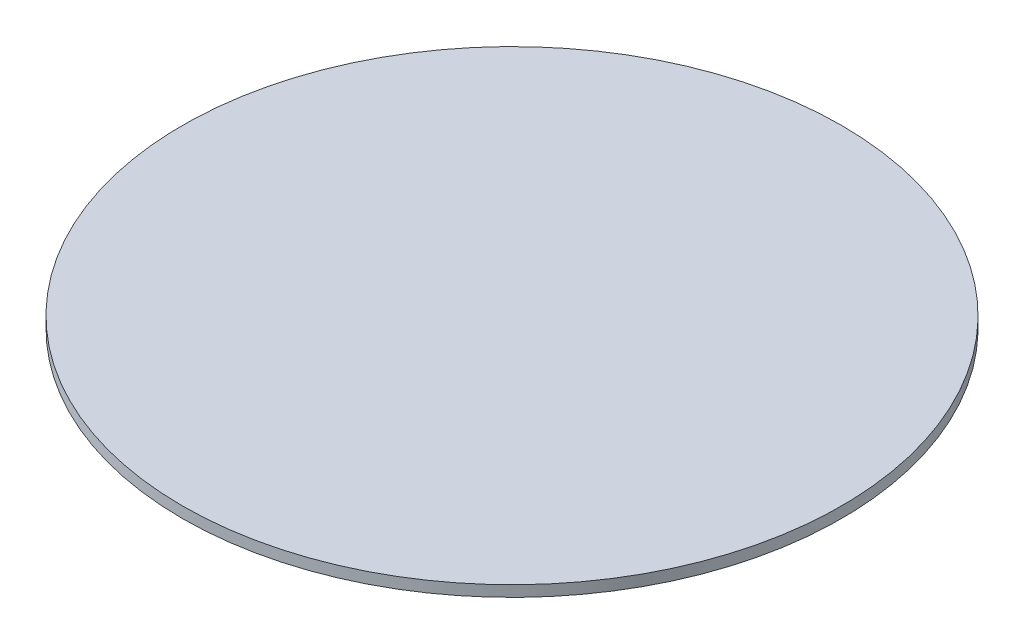
ISO-10303-21;
HEADER;
FILE_DESCRIPTION(('STEP AP214'),'2;1');
FILE_NAME('part.step','',(''),(''),'','','');
FILE_SCHEMA(('AUTOMOTIVE_DESIGN { 1 0 10303 214 1 1 1 1 }'));
ENDSEC;
DATA;
#1=APPLICATION_CONTEXT('core data for automotive mechanical design processes');
#2=APPLICATION_PROTOCOL_DEFINITION('international standard','automotive_design',2000,#1);
#3=PRODUCT_CONTEXT('',#1,'mechanical');
#4=PRODUCT('Part','Part','',(#3));
#5=PRODUCT_RELATED_PRODUCT_CATEGORY('part','',(#4));
#6=PRODUCT_DEFINITION_FORMATION('','',#4);
#7=PRODUCT_DEFINITION_CONTEXT('part definition',#1,'design');
#8=PRODUCT_DEFINITION('design','',#6,#7);
#9=PRODUCT_DEFINITION_SHAPE('','',#8);
#10=(LENGTH_UNIT() NAMED_UNIT(*) SI_UNIT(.MILLI.,.METRE.));
#11=(NAMED_UNIT(*) PLANE_ANGLE_UNIT() SI_UNIT($,.RADIAN.));
#12=(NAMED_UNIT(*) SI_UNIT($,.STERADIAN.) SOLID_ANGLE_UNIT());
#13=UNCERTAINTY_MEASURE_WITH_UNIT(LENGTH_MEASURE(1.E-05),#10,'distance_accuracy_value','');
#14=(GEOMETRIC_REPRESENTATION_CONTEXT(3) GLOBAL_UNCERTAINTY_ASSIGNED_CONTEXT((#13)) GLOBAL_UNIT_ASSIGNED_CONTEXT((#10,
#11,#12)) REPRESENTATION_CONTEXT('',''));
#15=CARTESIAN_POINT('',(0.,0.,0.));
#16=DIRECTION('',(0.,0.,1.));
#17=DIRECTION('',(1.,0.,0.));
#18=AXIS2_PLACEMENT_3D('',#15,#16,#17);
#19=CARTESIAN_POINT('',(0.,0.2,0.));
#20=DIRECTION('',(0.,-1.,0.));
#21=DIRECTION('',(0.,0.,-1.));
#22=AXIS2_PLACEMENT_3D('',#19,#20,#21);
#23=CYLINDRICAL_SURFACE('',#22,6.);
#24=CARTESIAN_POINT('',(0.,0.2,0.));
#25=DIRECTION('',(0.,1.,0.));
#26=DIRECTION('',(0.,0.,1.));
#27=AXIS2_PLACEMENT_3D('',#24,#25,#26);
#28=CIRCLE('',#27,6.);
#29=CARTESIAN_POINT('',(0.,0.2,6.));
#30=VERTEX_POINT('',#29);
#31=EDGE_CURVE('E10',#30,#30,#28,.T.);
#32=ORIENTED_EDGE('',*,*,#31,.F.);
#33=EDGE_LOOP('',(#32));
#34=FACE_BOUND('',#33,.T.);
#35=CARTESIAN_POINT('',(0.,0.,0.));
#36=DIRECTION('',(0.,1.,0.));
#37=DIRECTION('',(0.,0.,1.));
#38=AXIS2_PLACEMENT_3D('',#35,#36,#37);
#39=CIRCLE('',#38,6.);
#40=CARTESIAN_POINT('',(0.,0.,6.));
#41=VERTEX_POINT('',#40);
#42=EDGE_CURVE('E35',#41,#41,#39,.T.);
#43=ORIENTED_EDGE('',*,*,#42,.T.);
#44=EDGE_LOOP('',(#43));
#45=FACE_BOUND('',#44,.T.);
#46=ADVANCED_FACE('F32',(#34,#45),#23,.T.);
#47=CARTESIAN_POINT('',(0.,0.2,0.));
#48=DIRECTION('',(0.,1.,0.));
#49=DIRECTION('',(0.,0.,1.));
#50=AXIS2_PLACEMENT_3D('',#47,#48,#49);
#51=PLANE('',#50);
#52=ORIENTED_EDGE('',*,*,#31,.T.);
#53=EDGE_LOOP('',(#52));
#54=FACE_BOUND('',#53,.T.);
#55=ADVANCED_FACE('F47',(#54),#51,.T.);
#56=CARTESIAN_POINT('',(0.,0.,0.));
#57=DIRECTION('',(0.,1.,0.));
#58=DIRECTION('',(0.,0.,1.));
#59=AXIS2_PLACEMENT_3D('',#56,#57,#58);
#60=PLANE('',#59);
#61=ORIENTED_EDGE('',*,*,#42,.F.);
#62=EDGE_LOOP('',(#61));
#63=FACE_BOUND('',#62,.T.);
#64=ADVANCED_FACE('F45',(#63),#60,.F.);
#65=CLOSED_SHELL('',(#46,#55,#64));
#66=MANIFOLD_SOLID_BREP('B2',#65);
#67=ADVANCED_BREP_SHAPE_REPRESENTATION('',(#18,#66),#14);
#68=SHAPE_DEFINITION_REPRESENTATION(#9,#67);
ENDSEC;
END-ISO-10303-21;
